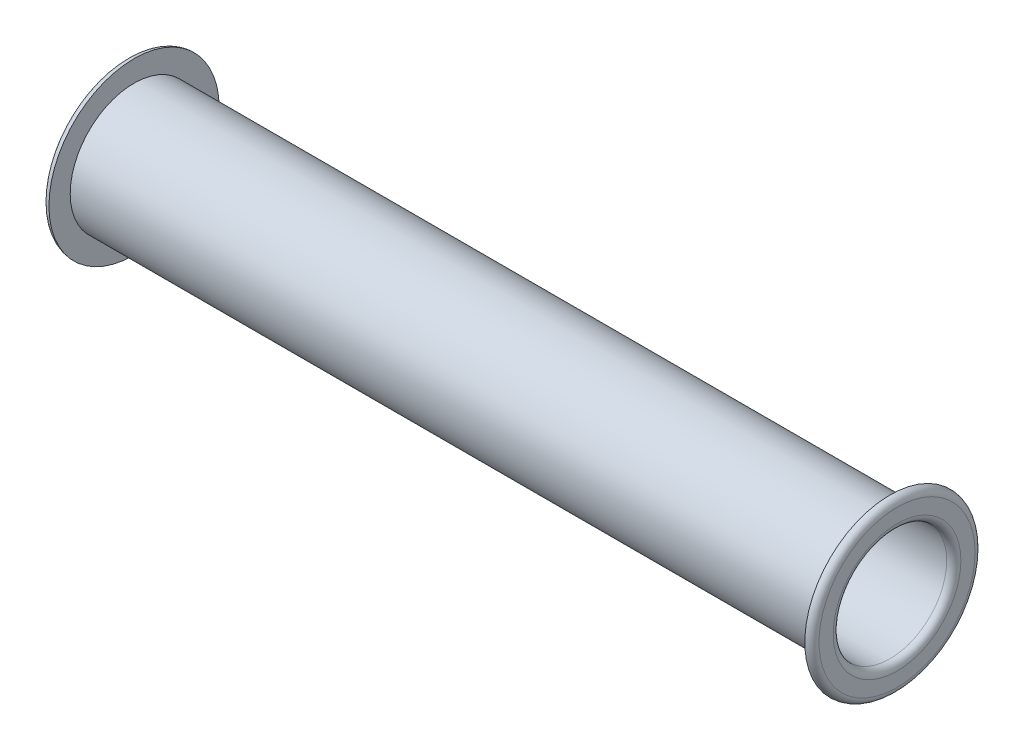
ISO-10303-21;
HEADER;
FILE_DESCRIPTION(('STEP AP214'),'2;1');
FILE_NAME('part.step','',(''),(''),'','','');
FILE_SCHEMA(('AUTOMOTIVE_DESIGN { 1 0 10303 214 1 1 1 1 }'));
ENDSEC;
DATA;
#1=APPLICATION_CONTEXT('core data for automotive mechanical design processes');
#2=APPLICATION_PROTOCOL_DEFINITION('international standard','automotive_design',2000,#1);
#3=PRODUCT_CONTEXT('',#1,'mechanical');
#4=PRODUCT('Part','Part','',(#3));
#5=PRODUCT_RELATED_PRODUCT_CATEGORY('part','',(#4));
#6=PRODUCT_DEFINITION_FORMATION('','',#4);
#7=PRODUCT_DEFINITION_CONTEXT('part definition',#1,'design');
#8=PRODUCT_DEFINITION('design','',#6,#7);
#9=PRODUCT_DEFINITION_SHAPE('','',#8);
#10=(LENGTH_UNIT() NAMED_UNIT(*) SI_UNIT(.MILLI.,.METRE.));
#11=(NAMED_UNIT(*) PLANE_ANGLE_UNIT() SI_UNIT($,.RADIAN.));
#12=(NAMED_UNIT(*) SI_UNIT($,.STERADIAN.) SOLID_ANGLE_UNIT());
#13=UNCERTAINTY_MEASURE_WITH_UNIT(LENGTH_MEASURE(1.E-05),#10,'distance_accuracy_value','');
#14=(GEOMETRIC_REPRESENTATION_CONTEXT(3) GLOBAL_UNCERTAINTY_ASSIGNED_CONTEXT((#13)) GLOBAL_UNIT_ASSIGNED_CONTEXT((#10,
#11,#12)) REPRESENTATION_CONTEXT('',''));
#15=CARTESIAN_POINT('',(0.,0.,0.));
#16=DIRECTION('',(0.,0.,1.));
#17=DIRECTION('',(1.,0.,0.));
#18=AXIS2_PLACEMENT_3D('',#15,#16,#17);
#19=CARTESIAN_POINT('',(13.53185,0.,0.));
#20=DIRECTION('',(-1.,0.,0.));
#21=DIRECTION('',(0.,0.,1.));
#22=AXIS2_PLACEMENT_3D('',#19,#20,#21);
#23=CYLINDRICAL_SURFACE('',#22,2.286);
#24=CARTESIAN_POINT('',(13.53185,0.,0.));
#25=DIRECTION('',(1.,0.,0.));
#26=DIRECTION('',(0.,0.,-1.));
#27=AXIS2_PLACEMENT_3D('',#24,#25,#26);
#28=CIRCLE('',#27,2.286);
#29=CARTESIAN_POINT('',(13.53185,0.,2.286));
#30=VERTEX_POINT('',#29);
#31=EDGE_CURVE('E54',#30,#30,#28,.T.);
#32=CARTESIAN_POINT('',(-13.53185,0.,0.));
#33=DIRECTION('',(-1.,0.,0.));
#34=DIRECTION('',(0.,0.,1.));
#35=AXIS2_PLACEMENT_3D('',#32,#33,#34);
#36=CIRCLE('',#35,2.286);
#37=CARTESIAN_POINT('',(-13.53185,0.,2.286));
#38=VERTEX_POINT('',#37);
#39=EDGE_CURVE('E60',#38,#38,#36,.T.);
#40=CARTESIAN_POINT('',(13.53185,0.,2.286));
#41=CARTESIAN_POINT('',(13.2499364583333,0.,2.286));
#42=CARTESIAN_POINT('',(12.9680229166667,0.,2.286));
#43=CARTESIAN_POINT('',(12.4041958333333,0.,2.286));
#44=CARTESIAN_POINT('',(12.1222822916667,0.,2.286));
#45=CARTESIAN_POINT('',(11.5584552083333,0.,2.286));
#46=CARTESIAN_POINT('',(11.2765416666667,0.,2.286));
#47=CARTESIAN_POINT('',(10.7127145833333,0.,2.286));
#48=CARTESIAN_POINT('',(10.4308010416667,0.,2.286));
#49=CARTESIAN_POINT('',(9.86697395833333,0.,2.286));
#50=CARTESIAN_POINT('',(9.58506041666666,0.,2.286));
#51=CARTESIAN_POINT('',(9.02123333333333,0.,2.286));
#52=CARTESIAN_POINT('',(8.73931979166666,0.,2.286));
#53=CARTESIAN_POINT('',(8.17549270833333,0.,2.286));
#54=CARTESIAN_POINT('',(7.89357916666667,0.,2.286));
#55=CARTESIAN_POINT('',(7.32975208333333,0.,2.286));
#56=CARTESIAN_POINT('',(7.04783854166667,0.,2.286));
#57=CARTESIAN_POINT('',(6.48401145833333,0.,2.286));
#58=CARTESIAN_POINT('',(6.20209791666667,0.,2.286));
#59=CARTESIAN_POINT('',(5.63827083333333,0.,2.286));
#60=CARTESIAN_POINT('',(5.35635729166667,0.,2.286));
#61=CARTESIAN_POINT('',(4.79253020833333,0.,2.286));
#62=CARTESIAN_POINT('',(4.51061666666667,0.,2.286));
#63=CARTESIAN_POINT('',(3.94678958333333,0.,2.286));
#64=CARTESIAN_POINT('',(3.66487604166667,0.,2.286));
#65=CARTESIAN_POINT('',(3.10104895833333,0.,2.286));
#66=CARTESIAN_POINT('',(2.81913541666667,0.,2.286));
#67=CARTESIAN_POINT('',(2.25530833333333,0.,2.286));
#68=CARTESIAN_POINT('',(1.97339479166667,0.,2.286));
#69=CARTESIAN_POINT('',(1.40956770833333,0.,2.286));
#70=CARTESIAN_POINT('',(1.12765416666667,0.,2.286));
#71=CARTESIAN_POINT('',(0.563827083333334,0.,2.286));
#72=CARTESIAN_POINT('',(0.281913541666667,0.,2.286));
#73=CARTESIAN_POINT('',(-0.281913541666667,0.,2.286));
#74=CARTESIAN_POINT('',(-0.563827083333334,0.,2.286));
#75=CARTESIAN_POINT('',(-1.12765416666667,0.,2.286));
#76=CARTESIAN_POINT('',(-1.40956770833333,0.,2.286));
#77=CARTESIAN_POINT('',(-1.97339479166666,0.,2.286));
#78=CARTESIAN_POINT('',(-2.25530833333333,0.,2.286));
#79=CARTESIAN_POINT('',(-2.81913541666666,0.,2.286));
#80=CARTESIAN_POINT('',(-3.10104895833333,0.,2.286));
#81=CARTESIAN_POINT('',(-3.66487604166666,0.,2.286));
#82=CARTESIAN_POINT('',(-3.94678958333333,0.,2.286));
#83=CARTESIAN_POINT('',(-4.51061666666666,0.,2.286));
#84=CARTESIAN_POINT('',(-4.79253020833333,0.,2.286));
#85=CARTESIAN_POINT('',(-5.35635729166666,0.,2.286));
#86=CARTESIAN_POINT('',(-5.63827083333333,0.,2.286));
#87=CARTESIAN_POINT('',(-6.20209791666666,0.,2.286));
#88=CARTESIAN_POINT('',(-6.48401145833333,0.,2.286));
#89=CARTESIAN_POINT('',(-7.04783854166666,0.,2.286));
#90=CARTESIAN_POINT('',(-7.32975208333333,0.,2.286));
#91=CARTESIAN_POINT('',(-7.89357916666666,0.,2.286));
#92=CARTESIAN_POINT('',(-8.17549270833333,0.,2.286));
#93=CARTESIAN_POINT('',(-8.73931979166666,0.,2.286));
#94=CARTESIAN_POINT('',(-9.02123333333333,0.,2.286));
#95=CARTESIAN_POINT('',(-9.58506041666666,0.,2.286));
#96=CARTESIAN_POINT('',(-9.86697395833333,0.,2.286));
#97=CARTESIAN_POINT('',(-10.4308010416667,0.,2.286));
#98=CARTESIAN_POINT('',(-10.7127145833333,0.,2.286));
#99=CARTESIAN_POINT('',(-11.2765416666667,0.,2.286));
#100=CARTESIAN_POINT('',(-11.5584552083333,0.,2.286));
#101=CARTESIAN_POINT('',(-12.1222822916667,0.,2.286));
#102=CARTESIAN_POINT('',(-12.4041958333333,0.,2.286));
#103=CARTESIAN_POINT('',(-12.9680229166667,0.,2.286));
#104=CARTESIAN_POINT('',(-13.2499364583333,0.,2.286));
#105=CARTESIAN_POINT('',(-13.53185,0.,2.286));
#106=B_SPLINE_CURVE_WITH_KNOTS('',3,(#40,#41,#42,#43,#44,#45,#46,#47,#48,#49,#50,#51,#52,#53,
#54,#55,#56,#57,#58,#59,#60,#61,#62,#63,#64,#65,#66,#67,#68,#69,#70,#71,#72,#73,#74,#75,#76,#77,
#78,#79,#80,#81,#82,#83,#84,#85,#86,#87,#88,#89,#90,#91,#92,#93,#94,#95,#96,#97,#98,#99,#100,
#101,#102,#103,#104,#105),.UNSPECIFIED.,.F.,.F.,(4,2,2,2,2,2,2,2,2,2,2,2,2,2,2,2,2,2,2,2,2,2,2,
2,2,2,2,2,2,2,2,2,4),(0.,0.845740624999999,1.69148125,2.537221875,3.3829625,4.228703125,
5.07444375,5.920184375,6.765925,7.611665625,8.45740625,9.303146875,10.1488875,10.994628125,
11.84036875,12.686109375,13.53185,14.377590625,15.22333125,16.069071875,16.9148125,17.760553125,
18.60629375,19.452034375,20.297775,21.143515625,21.98925625,22.834996875,23.6807375,
24.526478125,25.37221875,26.217959375,27.0637),.UNSPECIFIED.);
#107=EDGE_CURVE('BSEAM28',#30,#38,#106,.T.);
#108=ORIENTED_EDGE('',*,*,#31,.F.);
#109=ORIENTED_EDGE('',*,*,#39,.F.);
#110=ORIENTED_EDGE('',*,*,#107,.T.);
#111=ORIENTED_EDGE('',*,*,#107,.F.);
#112=EDGE_LOOP('',(#108,#110,#109,#111));
#113=FACE_BOUND('',#112,.T.);
#114=ADVANCED_FACE('F28',(#113),#23,.T.);
#115=CARTESIAN_POINT('',(13.53185,0.,0.));
#116=DIRECTION('',(1.,0.,0.));
#117=DIRECTION('',(0.,0.,-1.));
#118=AXIS2_PLACEMENT_3D('',#115,#116,#117);
#119=PLANE('',#118);
#120=CARTESIAN_POINT('',(13.53185,0.,0.));
#121=DIRECTION('',(1.,0.,0.));
#122=DIRECTION('',(0.,0.,-1.));
#123=AXIS2_PLACEMENT_3D('',#120,#121,#122);
#124=CIRCLE('',#123,3.048);
#125=CARTESIAN_POINT('',(13.53185,0.,-3.048));
#126=VERTEX_POINT('',#125);
#127=EDGE_CURVE('E57',#126,#126,#124,.T.);
#128=ORIENTED_EDGE('',*,*,#127,.F.);
#129=EDGE_LOOP('',(#128));
#130=FACE_BOUND('',#129,.T.);
#131=ORIENTED_EDGE('',*,*,#31,.T.);
#132=EDGE_LOOP('',(#131));
#133=FACE_BOUND('',#132,.T.);
#134=ADVANCED_FACE('F87',(#130,#133),#119,.F.);
#135=CARTESIAN_POINT('',(13.78585,0.,0.));
#136=DIRECTION('',(1.,0.,0.));
#137=DIRECTION('',(0.,0.,-1.));
#138=AXIS2_PLACEMENT_3D('',#135,#136,#137);
#139=PLANE('',#138);
#140=CARTESIAN_POINT('',(13.78585,0.,0.));
#141=DIRECTION('',(1.,0.,0.));
#142=DIRECTION('',(0.,0.,-1.));
#143=AXIS2_PLACEMENT_3D('',#140,#141,#142);
#144=CIRCLE('',#143,2.286);
#145=CARTESIAN_POINT('',(13.78585,0.,-2.286));
#146=VERTEX_POINT('',#145);
#147=EDGE_CURVE('E10',#146,#146,#144,.F.);
#148=ORIENTED_EDGE('',*,*,#147,.T.);
#149=EDGE_LOOP('',(#148));
#150=FACE_BOUND('',#149,.T.);
#151=CARTESIAN_POINT('',(13.78585,0.,0.));
#152=DIRECTION('',(1.,0.,0.));
#153=DIRECTION('',(0.,0.,-1.));
#154=AXIS2_PLACEMENT_3D('',#151,#152,#153);
#155=CIRCLE('',#154,2.794);
#156=CARTESIAN_POINT('',(13.78585,0.,-2.794));
#157=VERTEX_POINT('',#156);
#158=EDGE_CURVE('E51',#157,#157,#155,.T.);
#159=ORIENTED_EDGE('',*,*,#158,.T.);
#160=EDGE_LOOP('',(#159));
#161=FACE_BOUND('',#160,.T.);
#162=ADVANCED_FACE('F93',(#150,#161),#139,.T.);
#163=CARTESIAN_POINT('',(13.53185,0.,0.));
#164=DIRECTION('',(1.,0.,0.));
#165=DIRECTION('',(0.,0.,-1.));
#166=AXIS2_PLACEMENT_3D('',#163,#164,#165);
#167=TOROIDAL_SURFACE('',#166,2.794,0.254);
#168=ORIENTED_EDGE('',*,*,#127,.T.);
#169=EDGE_LOOP('',(#168));
#170=FACE_BOUND('',#169,.T.);
#171=ORIENTED_EDGE('',*,*,#158,.F.);
#172=EDGE_LOOP('',(#171));
#173=FACE_BOUND('',#172,.T.);
#174=ADVANCED_FACE('F99',(#170,#173),#167,.T.);
#175=CARTESIAN_POINT('',(-13.53185,0.,0.));
#176=DIRECTION('',(-1.,0.,0.));
#177=DIRECTION('',(0.,0.,-1.));
#178=AXIS2_PLACEMENT_3D('',#175,#176,#177);
#179=PLANE('',#178);
#180=CARTESIAN_POINT('',(-13.53185,0.,0.));
#181=DIRECTION('',(1.,0.,0.));
#182=DIRECTION('',(0.,0.,-1.));
#183=AXIS2_PLACEMENT_3D('',#180,#181,#182);
#184=CIRCLE('',#183,3.048);
#185=CARTESIAN_POINT('',(-13.53185,0.,-3.048));
#186=VERTEX_POINT('',#185);
#187=EDGE_CURVE('E63',#186,#186,#184,.T.);
#188=ORIENTED_EDGE('',*,*,#187,.T.);
#189=EDGE_LOOP('',(#188));
#190=FACE_BOUND('',#189,.T.);
#191=ORIENTED_EDGE('',*,*,#39,.T.);
#192=EDGE_LOOP('',(#191));
#193=FACE_BOUND('',#192,.T.);
#194=ADVANCED_FACE('F67',(#190,#193),#179,.F.);
#195=CARTESIAN_POINT('',(-13.78585,0.,0.));
#196=DIRECTION('',(-1.,0.,0.));
#197=DIRECTION('',(0.,0.,-1.));
#198=AXIS2_PLACEMENT_3D('',#195,#196,#197);
#199=PLANE('',#198);
#200=CARTESIAN_POINT('',(-13.78585,0.,0.));
#201=DIRECTION('',(-1.,0.,0.));
#202=DIRECTION('',(0.,0.,1.));
#203=AXIS2_PLACEMENT_3D('',#200,#201,#202);
#204=CIRCLE('',#203,2.286);
#205=CARTESIAN_POINT('',(-13.78585,0.,2.286));
#206=VERTEX_POINT('',#205);
#207=EDGE_CURVE('E43',#206,#206,#204,.F.);
#208=ORIENTED_EDGE('',*,*,#207,.T.);
#209=EDGE_LOOP('',(#208));
#210=FACE_BOUND('',#209,.T.);
#211=CARTESIAN_POINT('',(-13.78585,0.,0.));
#212=DIRECTION('',(-1.,0.,0.));
#213=DIRECTION('',(0.,0.,1.));
#214=AXIS2_PLACEMENT_3D('',#211,#212,#213);
#215=CIRCLE('',#214,2.794);
#216=CARTESIAN_POINT('',(-13.78585,0.,2.794));
#217=VERTEX_POINT('',#216);
#218=EDGE_CURVE('E48',#217,#217,#215,.T.);
#219=ORIENTED_EDGE('',*,*,#218,.T.);
#220=EDGE_LOOP('',(#219));
#221=FACE_BOUND('',#220,.T.);
#222=ADVANCED_FACE('F73',(#210,#221),#199,.T.);
#223=CARTESIAN_POINT('',(-13.53185,0.,0.));
#224=DIRECTION('',(-1.,0.,0.));
#225=DIRECTION('',(0.,0.,1.));
#226=AXIS2_PLACEMENT_3D('',#223,#224,#225);
#227=TOROIDAL_SURFACE('',#226,2.794,0.254);
#228=ORIENTED_EDGE('',*,*,#218,.F.);
#229=EDGE_LOOP('',(#228));
#230=FACE_BOUND('',#229,.T.);
#231=ORIENTED_EDGE('',*,*,#187,.F.);
#232=EDGE_LOOP('',(#231));
#233=FACE_BOUND('',#232,.T.);
#234=ADVANCED_FACE('F70',(#230,#233),#227,.T.);
#235=CARTESIAN_POINT('',(-13.78585,0.,0.));
#236=DIRECTION('',(1.,0.,0.));
#237=DIRECTION('',(0.,0.,-1.));
#238=AXIS2_PLACEMENT_3D('',#235,#236,#237);
#239=CYLINDRICAL_SURFACE('',#238,2.032);
#240=CARTESIAN_POINT('',(-13.53185,0.,0.));
#241=DIRECTION('',(-1.,0.,0.));
#242=DIRECTION('',(0.,0.,1.));
#243=AXIS2_PLACEMENT_3D('',#240,#241,#242);
#244=CIRCLE('',#243,2.032);
#245=CARTESIAN_POINT('',(-13.53185,0.,2.032));
#246=VERTEX_POINT('',#245);
#247=EDGE_CURVE('E35',#246,#246,#244,.T.);
#248=ORIENTED_EDGE('',*,*,#247,.T.);
#249=EDGE_LOOP('',(#248));
#250=FACE_BOUND('',#249,.T.);
#251=CARTESIAN_POINT('',(13.53185,0.,0.));
#252=DIRECTION('',(1.,0.,0.));
#253=DIRECTION('',(0.,0.,-1.));
#254=AXIS2_PLACEMENT_3D('',#251,#252,#253);
#255=CIRCLE('',#254,2.032);
#256=CARTESIAN_POINT('',(13.53185,0.,-2.032));
#257=VERTEX_POINT('',#256);
#258=EDGE_CURVE('E39',#257,#257,#255,.T.);
#259=ORIENTED_EDGE('',*,*,#258,.T.);
#260=EDGE_LOOP('',(#259));
#261=FACE_BOUND('',#260,.T.);
#262=ADVANCED_FACE('F72',(#250,#261),#239,.F.);
#263=CARTESIAN_POINT('',(-13.53185,0.,0.));
#264=DIRECTION('',(-1.,0.,0.));
#265=DIRECTION('',(0.,0.,1.));
#266=AXIS2_PLACEMENT_3D('',#263,#264,#265);
#267=TOROIDAL_SURFACE('',#266,2.286,0.254);
#268=ORIENTED_EDGE('',*,*,#247,.F.);
#269=EDGE_LOOP('',(#268));
#270=FACE_BOUND('',#269,.T.);
#271=ORIENTED_EDGE('',*,*,#207,.F.);
#272=EDGE_LOOP('',(#271));
#273=FACE_BOUND('',#272,.T.);
#274=ADVANCED_FACE('F80',(#270,#273),#267,.T.);
#275=CARTESIAN_POINT('',(13.53185,0.,0.));
#276=DIRECTION('',(1.,0.,0.));
#277=DIRECTION('',(0.,0.,-1.));
#278=AXIS2_PLACEMENT_3D('',#275,#276,#277);
#279=TOROIDAL_SURFACE('',#278,2.286,0.254);
#280=ORIENTED_EDGE('',*,*,#147,.F.);
#281=EDGE_LOOP('',(#280));
#282=FACE_BOUND('',#281,.T.);
#283=ORIENTED_EDGE('',*,*,#258,.F.);
#284=EDGE_LOOP('',(#283));
#285=FACE_BOUND('',#284,.T.);
#286=ADVANCED_FACE('F30',(#282,#285),#279,.T.);
#287=CLOSED_SHELL('',(#114,#134,#162,#174,#194,#222,#234,#262,#274,#286));
#288=MANIFOLD_SOLID_BREP('B2',#287);
#289=ADVANCED_BREP_SHAPE_REPRESENTATION('',(#18,#288),#14);
#290=SHAPE_DEFINITION_REPRESENTATION(#9,#289);
ENDSEC;
END-ISO-10303-21;
